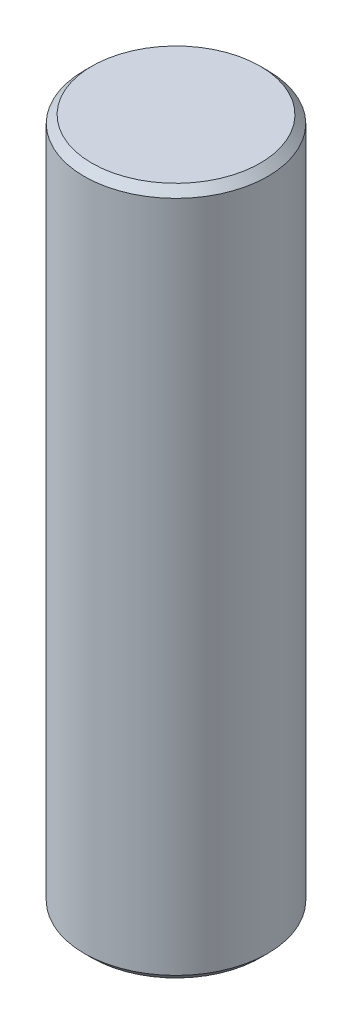
ISO-10303-21;
HEADER;
FILE_DESCRIPTION(('STEP AP214'),'2;1');
FILE_NAME('part.step','',(''),(''),'','','');
FILE_SCHEMA(('AUTOMOTIVE_DESIGN { 1 0 10303 214 1 1 1 1 }'));
ENDSEC;
DATA;
#1=APPLICATION_CONTEXT('core data for automotive mechanical design processes');
#2=APPLICATION_PROTOCOL_DEFINITION('international standard','automotive_design',2000,#1);
#3=PRODUCT_CONTEXT('',#1,'mechanical');
#4=PRODUCT('Part','Part','',(#3));
#5=PRODUCT_RELATED_PRODUCT_CATEGORY('part','',(#4));
#6=PRODUCT_DEFINITION_FORMATION('','',#4);
#7=PRODUCT_DEFINITION_CONTEXT('part definition',#1,'design');
#8=PRODUCT_DEFINITION('design','',#6,#7);
#9=PRODUCT_DEFINITION_SHAPE('','',#8);
#10=(LENGTH_UNIT() NAMED_UNIT(*) SI_UNIT(.MILLI.,.METRE.));
#11=(NAMED_UNIT(*) PLANE_ANGLE_UNIT() SI_UNIT($,.RADIAN.));
#12=(NAMED_UNIT(*) SI_UNIT($,.STERADIAN.) SOLID_ANGLE_UNIT());
#13=UNCERTAINTY_MEASURE_WITH_UNIT(LENGTH_MEASURE(1.E-05),#10,'distance_accuracy_value','');
#14=(GEOMETRIC_REPRESENTATION_CONTEXT(3) GLOBAL_UNCERTAINTY_ASSIGNED_CONTEXT((#13)) GLOBAL_UNIT_ASSIGNED_CONTEXT((#10,
#11,#12)) REPRESENTATION_CONTEXT('',''));
#15=CARTESIAN_POINT('',(0.,0.,0.));
#16=DIRECTION('',(0.,0.,1.));
#17=DIRECTION('',(1.,0.,0.));
#18=AXIS2_PLACEMENT_3D('',#15,#16,#17);
#19=CARTESIAN_POINT('',(-6.00000000000001,0.,0.));
#20=DIRECTION('',(0.,1.,0.));
#21=DIRECTION('',(0.,0.,1.));
#22=AXIS2_PLACEMENT_3D('',#19,#20,#21);
#23=PLANE('',#22);
#24=CARTESIAN_POINT('',(0.,0.,0.));
#25=DIRECTION('',(0.,1.,0.));
#26=DIRECTION('',(0.,0.,1.));
#27=AXIS2_PLACEMENT_3D('',#24,#25,#26);
#28=CIRCLE('',#27,5.50000000000001);
#29=CARTESIAN_POINT('',(0.,0.,5.50000000000001));
#30=VERTEX_POINT('',#29);
#31=EDGE_CURVE('E46',#30,#30,#28,.F.);
#32=ORIENTED_EDGE('',*,*,#31,.T.);
#33=EDGE_LOOP('',(#32));
#34=FACE_BOUND('',#33,.T.);
#35=ADVANCED_FACE('F31',(#34),#23,.F.);
#36=CARTESIAN_POINT('',(0.,45.,0.));
#37=DIRECTION('',(0.,-1.,0.));
#38=DIRECTION('',(0.,0.,-1.));
#39=AXIS2_PLACEMENT_3D('',#36,#37,#38);
#40=PLANE('',#39);
#41=CARTESIAN_POINT('',(0.,45.,0.));
#42=DIRECTION('',(0.,-1.,0.));
#43=DIRECTION('',(0.,0.,-1.));
#44=AXIS2_PLACEMENT_3D('',#41,#42,#43);
#45=CIRCLE('',#44,5.49999999999999);
#46=CARTESIAN_POINT('',(0.,45.,-5.49999999999999));
#47=VERTEX_POINT('',#46);
#48=EDGE_CURVE('E10',#47,#47,#45,.F.);
#49=ORIENTED_EDGE('',*,*,#48,.T.);
#50=EDGE_LOOP('',(#49));
#51=FACE_BOUND('',#50,.T.);
#52=ADVANCED_FACE('F62',(#51),#40,.F.);
#53=CARTESIAN_POINT('',(0.,0.,0.));
#54=DIRECTION('',(0.,-1.,0.));
#55=DIRECTION('',(0.,0.,-1.));
#56=AXIS2_PLACEMENT_3D('',#53,#54,#55);
#57=CYLINDRICAL_SURFACE('',#56,6.);
#58=CARTESIAN_POINT('',(0.,0.499999999999996,0.));
#59=DIRECTION('',(0.,1.,0.));
#60=DIRECTION('',(0.,0.,1.));
#61=AXIS2_PLACEMENT_3D('',#58,#59,#60);
#62=CIRCLE('',#61,6.);
#63=CARTESIAN_POINT('',(0.,0.499999999999996,6.));
#64=VERTEX_POINT('',#63);
#65=EDGE_CURVE('E38',#64,#64,#62,.T.);
#66=ORIENTED_EDGE('',*,*,#65,.T.);
#67=EDGE_LOOP('',(#66));
#68=FACE_BOUND('',#67,.T.);
#69=CARTESIAN_POINT('',(0.,44.5,0.));
#70=DIRECTION('',(0.,-1.,0.));
#71=DIRECTION('',(0.,0.,-1.));
#72=AXIS2_PLACEMENT_3D('',#69,#70,#71);
#73=CIRCLE('',#72,6.);
#74=CARTESIAN_POINT('',(0.,44.5,-6.));
#75=VERTEX_POINT('',#74);
#76=EDGE_CURVE('E42',#75,#75,#73,.T.);
#77=ORIENTED_EDGE('',*,*,#76,.T.);
#78=EDGE_LOOP('',(#77));
#79=FACE_BOUND('',#78,.T.);
#80=ADVANCED_FACE('F55',(#68,#79),#57,.T.);
#81=CARTESIAN_POINT('',(0.,0.,0.));
#82=DIRECTION('',(0.,1.,0.));
#83=DIRECTION('',(0.,0.,1.));
#84=AXIS2_PLACEMENT_3D('',#81,#82,#83);
#85=CONICAL_SURFACE('',#84,5.50000000000001,0.785398163397448);
#86=ORIENTED_EDGE('',*,*,#65,.F.);
#87=EDGE_LOOP('',(#86));
#88=FACE_BOUND('',#87,.T.);
#89=ORIENTED_EDGE('',*,*,#31,.F.);
#90=EDGE_LOOP('',(#89));
#91=FACE_BOUND('',#90,.T.);
#92=ADVANCED_FACE('F53',(#88,#91),#85,.T.);
#93=CARTESIAN_POINT('',(0.,44.5,0.));
#94=DIRECTION('',(0.,-1.,0.));
#95=DIRECTION('',(0.,0.,-1.));
#96=AXIS2_PLACEMENT_3D('',#93,#94,#95);
#97=CONICAL_SURFACE('',#96,6.,0.785398163397444);
#98=ORIENTED_EDGE('',*,*,#48,.F.);
#99=EDGE_LOOP('',(#98));
#100=FACE_BOUND('',#99,.T.);
#101=ORIENTED_EDGE('',*,*,#76,.F.);
#102=EDGE_LOOP('',(#101));
#103=FACE_BOUND('',#102,.T.);
#104=ADVANCED_FACE('F33',(#100,#103),#97,.T.);
#105=CLOSED_SHELL('',(#35,#52,#80,#92,#104));
#106=MANIFOLD_SOLID_BREP('B2',#105);
#107=ADVANCED_BREP_SHAPE_REPRESENTATION('',(#18,#106),#14);
#108=SHAPE_DEFINITION_REPRESENTATION(#9,#107);
ENDSEC;
END-ISO-10303-21;
